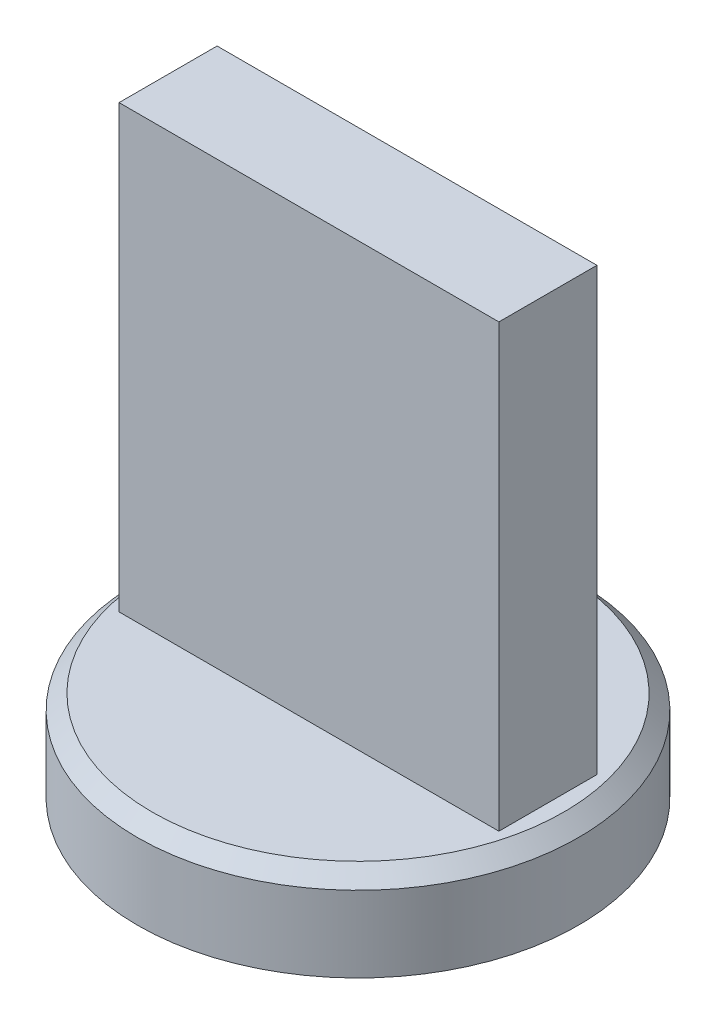
ISO-10303-21;
HEADER;
FILE_DESCRIPTION(('STEP AP214'),'2;1');
FILE_NAME('part.step','',(''),(''),'','','');
FILE_SCHEMA(('AUTOMOTIVE_DESIGN { 1 0 10303 214 1 1 1 1 }'));
ENDSEC;
DATA;
#1=APPLICATION_CONTEXT('core data for automotive mechanical design processes');
#2=APPLICATION_PROTOCOL_DEFINITION('international standard','automotive_design',2000,#1);
#3=PRODUCT_CONTEXT('',#1,'mechanical');
#4=PRODUCT('Part','Part','',(#3));
#5=PRODUCT_RELATED_PRODUCT_CATEGORY('part','',(#4));
#6=PRODUCT_DEFINITION_FORMATION('','',#4);
#7=PRODUCT_DEFINITION_CONTEXT('part definition',#1,'design');
#8=PRODUCT_DEFINITION('design','',#6,#7);
#9=PRODUCT_DEFINITION_SHAPE('','',#8);
#10=(LENGTH_UNIT() NAMED_UNIT(*) SI_UNIT(.MILLI.,.METRE.));
#11=(NAMED_UNIT(*) PLANE_ANGLE_UNIT() SI_UNIT($,.RADIAN.));
#12=(NAMED_UNIT(*) SI_UNIT($,.STERADIAN.) SOLID_ANGLE_UNIT());
#13=UNCERTAINTY_MEASURE_WITH_UNIT(LENGTH_MEASURE(1.E-05),#10,'distance_accuracy_value','');
#14=(GEOMETRIC_REPRESENTATION_CONTEXT(3) GLOBAL_UNCERTAINTY_ASSIGNED_CONTEXT((#13)) GLOBAL_UNIT_ASSIGNED_CONTEXT((#10,
#11,#12)) REPRESENTATION_CONTEXT('',''));
#15=CARTESIAN_POINT('',(0.,0.,0.));
#16=DIRECTION('',(0.,0.,1.));
#17=DIRECTION('',(1.,0.,0.));
#18=AXIS2_PLACEMENT_3D('',#15,#16,#17);
#19=CARTESIAN_POINT('',(0.,37.,0.));
#20=DIRECTION('',(0.,-1.,0.));
#21=DIRECTION('',(0.,0.,-1.));
#22=AXIS2_PLACEMENT_3D('',#19,#20,#21);
#23=CYLINDRICAL_SURFACE('',#22,90.);
#24=CARTESIAN_POINT('',(0.,31.,0.));
#25=DIRECTION('',(0.,1.,0.));
#26=DIRECTION('',(0.,0.,1.));
#27=AXIS2_PLACEMENT_3D('',#24,#25,#26);
#28=CIRCLE('',#27,90.);
#29=CARTESIAN_POINT('',(0.,31.,90.));
#30=VERTEX_POINT('',#29);
#31=EDGE_CURVE('E13',#30,#30,#28,.F.);
#32=ORIENTED_EDGE('',*,*,#31,.T.);
#33=EDGE_LOOP('',(#32));
#34=FACE_BOUND('',#33,.T.);
#35=CARTESIAN_POINT('',(0.,0.,0.));
#36=DIRECTION('',(0.,1.,0.));
#37=DIRECTION('',(0.,0.,1.));
#38=AXIS2_PLACEMENT_3D('',#35,#36,#37);
#39=CIRCLE('',#38,90.);
#40=CARTESIAN_POINT('',(0.,0.,90.));
#41=VERTEX_POINT('',#40);
#42=EDGE_CURVE('E105',#41,#41,#39,.T.);
#43=ORIENTED_EDGE('',*,*,#42,.T.);
#44=EDGE_LOOP('',(#43));
#45=FACE_BOUND('',#44,.T.);
#46=ADVANCED_FACE('F43',(#34,#45),#23,.T.);
#47=CARTESIAN_POINT('',(0.,37.,0.));
#48=DIRECTION('',(0.,1.,0.));
#49=DIRECTION('',(0.,0.,1.));
#50=AXIS2_PLACEMENT_3D('',#47,#48,#49);
#51=PLANE('',#50);
#52=DIRECTION('',(0.,0.,-1.));
#53=VECTOR('',#52,1.);
#54=CARTESIAN_POINT('',(77.5,37.,-20.));
#55=LINE('',#54,#53);
#56=CARTESIAN_POINT('',(77.5,37.,20.));
#57=VERTEX_POINT('',#56);
#58=CARTESIAN_POINT('',(77.5,37.,-20.));
#59=VERTEX_POINT('',#58);
#60=EDGE_CURVE('E59',#57,#59,#55,.T.);
#61=ORIENTED_EDGE('',*,*,#60,.F.);
#62=DIRECTION('',(1.,0.,0.));
#63=VECTOR('',#62,1.);
#64=CARTESIAN_POINT('',(-77.5,37.,20.));
#65=LINE('',#64,#63);
#66=CARTESIAN_POINT('',(-77.5,37.,20.));
#67=VERTEX_POINT('',#66);
#68=EDGE_CURVE('E63',#67,#57,#65,.T.);
#69=ORIENTED_EDGE('',*,*,#68,.F.);
#70=DIRECTION('',(0.,0.,1.));
#71=VECTOR('',#70,1.);
#72=CARTESIAN_POINT('',(-77.5,37.,-20.));
#73=LINE('',#72,#71);
#74=CARTESIAN_POINT('',(-77.5,37.,-20.));
#75=VERTEX_POINT('',#74);
#76=EDGE_CURVE('E186',#75,#67,#73,.T.);
#77=ORIENTED_EDGE('',*,*,#76,.F.);
#78=DIRECTION('',(-1.,0.,0.));
#79=VECTOR('',#78,1.);
#80=CARTESIAN_POINT('',(-77.5,37.,-20.));
#81=LINE('',#80,#79);
#82=EDGE_CURVE('E184',#59,#75,#81,.T.);
#83=ORIENTED_EDGE('',*,*,#82,.F.);
#84=EDGE_LOOP('',(#61,#69,#77,#83));
#85=FACE_BOUND('',#84,.T.);
#86=CARTESIAN_POINT('',(0.,37.,0.));
#87=DIRECTION('',(0.,1.,0.));
#88=DIRECTION('',(0.,0.,1.));
#89=AXIS2_PLACEMENT_3D('',#86,#87,#88);
#90=CIRCLE('',#89,84.);
#91=CARTESIAN_POINT('',(0.,37.,84.));
#92=VERTEX_POINT('',#91);
#93=EDGE_CURVE('E52',#92,#92,#90,.T.);
#94=ORIENTED_EDGE('',*,*,#93,.T.);
#95=EDGE_LOOP('',(#94));
#96=FACE_BOUND('',#95,.T.);
#97=ADVANCED_FACE('F115',(#85,#96),#51,.T.);
#98=CARTESIAN_POINT('',(0.,0.,0.));
#99=DIRECTION('',(0.,1.,0.));
#100=DIRECTION('',(0.,0.,1.));
#101=AXIS2_PLACEMENT_3D('',#98,#99,#100);
#102=PLANE('',#101);
#103=CARTESIAN_POINT('',(0.,0.,0.));
#104=DIRECTION('',(0.,-1.,0.));
#105=DIRECTION('',(0.,0.,-1.));
#106=AXIS2_PLACEMENT_3D('',#103,#104,#105);
#107=CIRCLE('',#106,15.);
#108=CARTESIAN_POINT('',(0.,0.,-15.));
#109=VERTEX_POINT('',#108);
#110=EDGE_CURVE('E169',#109,#109,#107,.T.);
#111=ORIENTED_EDGE('',*,*,#110,.F.);
#112=EDGE_LOOP('',(#111));
#113=FACE_BOUND('',#112,.T.);
#114=ORIENTED_EDGE('',*,*,#42,.F.);
#115=EDGE_LOOP('',(#114));
#116=FACE_BOUND('',#115,.T.);
#117=ADVANCED_FACE('F118',(#113,#116),#102,.F.);
#118=CARTESIAN_POINT('',(0.,37.,0.));
#119=DIRECTION('',(0.,-1.,0.));
#120=DIRECTION('',(0.,0.,-1.));
#121=AXIS2_PLACEMENT_3D('',#118,#119,#120);
#122=CONICAL_SURFACE('',#121,84.,0.785398163397449);
#123=ORIENTED_EDGE('',*,*,#31,.F.);
#124=EDGE_LOOP('',(#123));
#125=FACE_BOUND('',#124,.T.);
#126=ORIENTED_EDGE('',*,*,#93,.F.);
#127=EDGE_LOOP('',(#126));
#128=FACE_BOUND('',#127,.T.);
#129=ADVANCED_FACE('F46',(#125,#128),#122,.T.);
#130=CARTESIAN_POINT('',(77.5,217.,-20.));
#131=DIRECTION('',(-1.,0.,0.));
#132=DIRECTION('',(0.,0.,1.));
#133=AXIS2_PLACEMENT_3D('',#130,#131,#132);
#134=PLANE('',#133);
#135=ORIENTED_EDGE('',*,*,#60,.T.);
#136=DIRECTION('',(0.,-1.,0.));
#137=VECTOR('',#136,1.);
#138=CARTESIAN_POINT('',(77.5,217.,-20.));
#139=LINE('',#138,#137);
#140=CARTESIAN_POINT('',(77.5,217.,-20.));
#141=VERTEX_POINT('',#140);
#142=EDGE_CURVE('E88',#141,#59,#139,.T.);
#143=ORIENTED_EDGE('',*,*,#142,.F.);
#144=DIRECTION('',(0.,0.,-1.));
#145=VECTOR('',#144,1.);
#146=CARTESIAN_POINT('',(77.5,217.,-20.));
#147=LINE('',#146,#145);
#148=CARTESIAN_POINT('',(77.5,217.,20.));
#149=VERTEX_POINT('',#148);
#150=EDGE_CURVE('E94',#149,#141,#147,.T.);
#151=ORIENTED_EDGE('',*,*,#150,.F.);
#152=DIRECTION('',(0.,-1.,0.));
#153=VECTOR('',#152,1.);
#154=CARTESIAN_POINT('',(77.5,217.,20.));
#155=LINE('',#154,#153);
#156=EDGE_CURVE('E182',#149,#57,#155,.T.);
#157=ORIENTED_EDGE('',*,*,#156,.T.);
#158=EDGE_LOOP('',(#135,#143,#151,#157));
#159=FACE_BOUND('',#158,.T.);
#160=ADVANCED_FACE('F104',(#159),#134,.F.);
#161=CARTESIAN_POINT('',(-77.5,217.,-20.));
#162=DIRECTION('',(0.,0.,1.));
#163=DIRECTION('',(1.,0.,0.));
#164=AXIS2_PLACEMENT_3D('',#161,#162,#163);
#165=PLANE('',#164);
#166=CARTESIAN_POINT('',(0.,197.,-20.));
#167=DIRECTION('',(0.,0.,-1.));
#168=DIRECTION('',(-1.,0.,0.));
#169=AXIS2_PLACEMENT_3D('',#166,#167,#168);
#170=CIRCLE('',#169,15.);
#171=CARTESIAN_POINT('',(-15.,197.,-20.));
#172=VERTEX_POINT('',#171);
#173=EDGE_CURVE('E170',#172,#172,#170,.T.);
#174=ORIENTED_EDGE('',*,*,#173,.F.);
#175=EDGE_LOOP('',(#174));
#176=FACE_BOUND('',#175,.T.);
#177=ORIENTED_EDGE('',*,*,#82,.T.);
#178=DIRECTION('',(0.,-1.,0.));
#179=VECTOR('',#178,1.);
#180=CARTESIAN_POINT('',(-77.5,217.,-20.));
#181=LINE('',#180,#179);
#182=CARTESIAN_POINT('',(-77.5,217.,-20.));
#183=VERTEX_POINT('',#182);
#184=EDGE_CURVE('E90',#183,#75,#181,.T.);
#185=ORIENTED_EDGE('',*,*,#184,.F.);
#186=DIRECTION('',(-1.,0.,0.));
#187=VECTOR('',#186,1.);
#188=CARTESIAN_POINT('',(-77.5,217.,-20.));
#189=LINE('',#188,#187);
#190=EDGE_CURVE('E83',#141,#183,#189,.T.);
#191=ORIENTED_EDGE('',*,*,#190,.F.);
#192=ORIENTED_EDGE('',*,*,#142,.T.);
#193=EDGE_LOOP('',(#177,#185,#191,#192));
#194=FACE_BOUND('',#193,.T.);
#195=ADVANCED_FACE('F86',(#176,#194),#165,.F.);
#196=CARTESIAN_POINT('',(-77.5,217.,-20.));
#197=DIRECTION('',(1.,0.,0.));
#198=DIRECTION('',(0.,0.,-1.));
#199=AXIS2_PLACEMENT_3D('',#196,#197,#198);
#200=PLANE('',#199);
#201=ORIENTED_EDGE('',*,*,#76,.T.);
#202=DIRECTION('',(0.,-1.,0.));
#203=VECTOR('',#202,1.);
#204=CARTESIAN_POINT('',(-77.5,217.,20.));
#205=LINE('',#204,#203);
#206=CARTESIAN_POINT('',(-77.5,217.,20.));
#207=VERTEX_POINT('',#206);
#208=EDGE_CURVE('E109',#207,#67,#205,.T.);
#209=ORIENTED_EDGE('',*,*,#208,.F.);
#210=DIRECTION('',(0.,0.,1.));
#211=VECTOR('',#210,1.);
#212=CARTESIAN_POINT('',(-77.5,217.,-20.));
#213=LINE('',#212,#211);
#214=EDGE_CURVE('E93',#183,#207,#213,.T.);
#215=ORIENTED_EDGE('',*,*,#214,.F.);
#216=ORIENTED_EDGE('',*,*,#184,.T.);
#217=EDGE_LOOP('',(#201,#209,#215,#216));
#218=FACE_BOUND('',#217,.T.);
#219=ADVANCED_FACE('F138',(#218),#200,.F.);
#220=CARTESIAN_POINT('',(-77.5,217.,20.));
#221=DIRECTION('',(0.,0.,-1.));
#222=DIRECTION('',(-1.,0.,0.));
#223=AXIS2_PLACEMENT_3D('',#220,#221,#222);
#224=PLANE('',#223);
#225=ORIENTED_EDGE('',*,*,#68,.T.);
#226=ORIENTED_EDGE('',*,*,#156,.F.);
#227=DIRECTION('',(1.,0.,0.));
#228=VECTOR('',#227,1.);
#229=CARTESIAN_POINT('',(-77.5,217.,20.));
#230=LINE('',#229,#228);
#231=EDGE_CURVE('E99',#207,#149,#230,.T.);
#232=ORIENTED_EDGE('',*,*,#231,.F.);
#233=ORIENTED_EDGE('',*,*,#208,.T.);
#234=EDGE_LOOP('',(#225,#226,#232,#233));
#235=FACE_BOUND('',#234,.T.);
#236=ADVANCED_FACE('F142',(#235),#224,.F.);
#237=CARTESIAN_POINT('',(0.,217.,0.));
#238=DIRECTION('',(0.,1.,0.));
#239=DIRECTION('',(0.,0.,1.));
#240=AXIS2_PLACEMENT_3D('',#237,#238,#239);
#241=PLANE('',#240);
#242=ORIENTED_EDGE('',*,*,#150,.T.);
#243=ORIENTED_EDGE('',*,*,#190,.T.);
#244=ORIENTED_EDGE('',*,*,#214,.T.);
#245=ORIENTED_EDGE('',*,*,#231,.T.);
#246=EDGE_LOOP('',(#242,#243,#244,#245));
#247=FACE_BOUND('',#246,.T.);
#248=ADVANCED_FACE('F97',(#247),#241,.T.);
#249=CARTESIAN_POINT('',(0.,20.,0.));
#250=DIRECTION('',(0.,-1.,0.));
#251=DIRECTION('',(0.,0.,-1.));
#252=AXIS2_PLACEMENT_3D('',#249,#250,#251);
#253=CYLINDRICAL_SURFACE('',#252,15.);
#254=CARTESIAN_POINT('',(0.,20.,0.));
#255=DIRECTION('',(0.,-1.,0.));
#256=DIRECTION('',(0.,0.,-1.));
#257=AXIS2_PLACEMENT_3D('',#254,#255,#256);
#258=CIRCLE('',#257,15.);
#259=CARTESIAN_POINT('',(0.,20.,-15.));
#260=VERTEX_POINT('',#259);
#261=EDGE_CURVE('E173',#260,#260,#258,.T.);
#262=ORIENTED_EDGE('',*,*,#261,.F.);
#263=EDGE_LOOP('',(#262));
#264=FACE_BOUND('',#263,.T.);
#265=ORIENTED_EDGE('',*,*,#110,.T.);
#266=EDGE_LOOP('',(#265));
#267=FACE_BOUND('',#266,.T.);
#268=ADVANCED_FACE('F149',(#264,#267),#253,.F.);
#269=CARTESIAN_POINT('',(0.,20.,0.));
#270=DIRECTION('',(0.,-1.,0.));
#271=DIRECTION('',(0.,0.,-1.));
#272=AXIS2_PLACEMENT_3D('',#269,#270,#271);
#273=PLANE('',#272);
#274=ORIENTED_EDGE('',*,*,#261,.T.);
#275=EDGE_LOOP('',(#274));
#276=FACE_BOUND('',#275,.T.);
#277=ADVANCED_FACE('F152',(#276),#273,.T.);
#278=CARTESIAN_POINT('',(0.,197.,0.));
#279=DIRECTION('',(0.,0.,-1.));
#280=DIRECTION('',(-1.,0.,0.));
#281=AXIS2_PLACEMENT_3D('',#278,#279,#280);
#282=CYLINDRICAL_SURFACE('',#281,15.);
#283=CARTESIAN_POINT('',(0.,197.,0.));
#284=DIRECTION('',(0.,0.,-1.));
#285=DIRECTION('',(-1.,0.,0.));
#286=AXIS2_PLACEMENT_3D('',#283,#284,#285);
#287=CIRCLE('',#286,15.);
#288=CARTESIAN_POINT('',(-15.,197.,0.));
#289=VERTEX_POINT('',#288);
#290=EDGE_CURVE('E168',#289,#289,#287,.T.);
#291=ORIENTED_EDGE('',*,*,#290,.F.);
#292=EDGE_LOOP('',(#291));
#293=FACE_BOUND('',#292,.T.);
#294=ORIENTED_EDGE('',*,*,#173,.T.);
#295=EDGE_LOOP('',(#294));
#296=FACE_BOUND('',#295,.T.);
#297=ADVANCED_FACE('F156',(#293,#296),#282,.F.);
#298=CARTESIAN_POINT('',(0.,197.,0.));
#299=DIRECTION('',(0.,0.,-1.));
#300=DIRECTION('',(-1.,0.,0.));
#301=AXIS2_PLACEMENT_3D('',#298,#299,#300);
#302=PLANE('',#301);
#303=ORIENTED_EDGE('',*,*,#290,.T.);
#304=EDGE_LOOP('',(#303));
#305=FACE_BOUND('',#304,.T.);
#306=ADVANCED_FACE('F160',(#305),#302,.T.);
#307=CLOSED_SHELL('',(#46,#97,#117,#129,#160,#195,#219,#236,#248,#268,#277,#297,#306));
#308=MANIFOLD_SOLID_BREP('B2',#307);
#309=ADVANCED_BREP_SHAPE_REPRESENTATION('',(#18,#308),#14);
#310=SHAPE_DEFINITION_REPRESENTATION(#9,#309);
ENDSEC;
END-ISO-10303-21;
